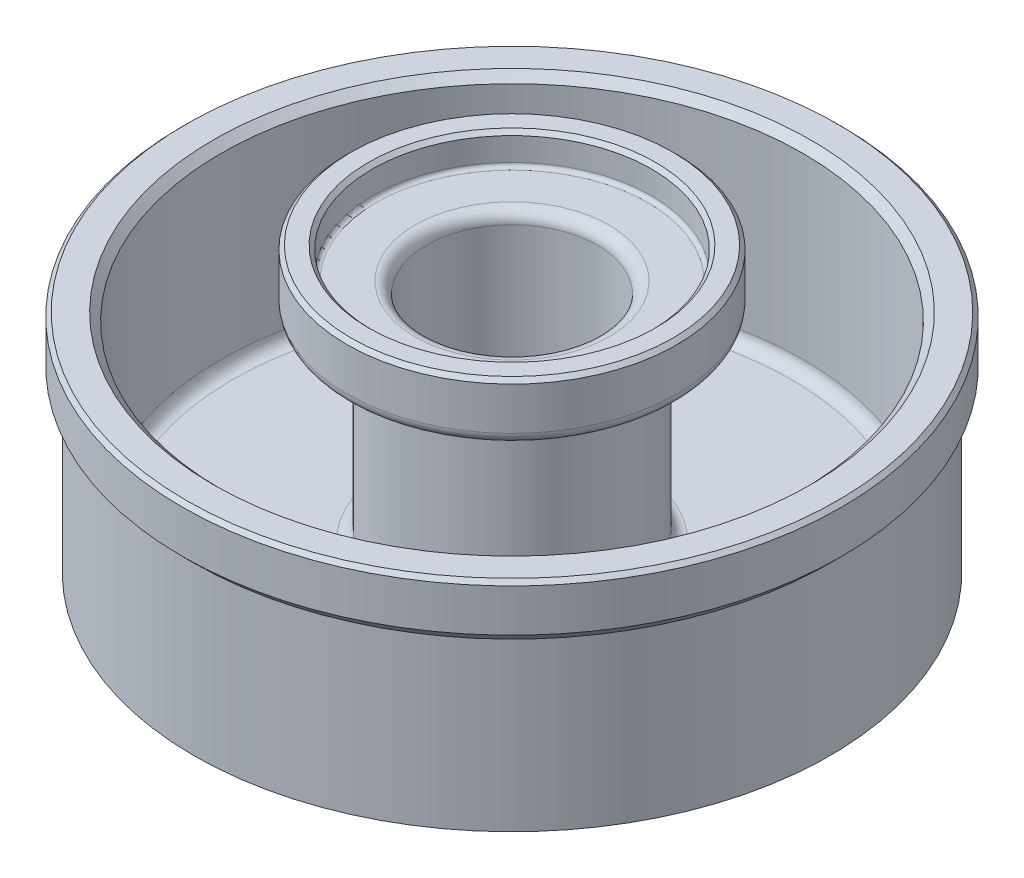
ISO-10303-21;
HEADER;
FILE_DESCRIPTION(('STEP AP214'),'2;1');
FILE_NAME('part.step','',(''),(''),'','','');
FILE_SCHEMA(('AUTOMOTIVE_DESIGN { 1 0 10303 214 1 1 1 1 }'));
ENDSEC;
DATA;
#1=APPLICATION_CONTEXT('core data for automotive mechanical design processes');
#2=APPLICATION_PROTOCOL_DEFINITION('international standard','automotive_design',2000,#1);
#3=PRODUCT_CONTEXT('',#1,'mechanical');
#4=PRODUCT('Part','Part','',(#3));
#5=PRODUCT_RELATED_PRODUCT_CATEGORY('part','',(#4));
#6=PRODUCT_DEFINITION_FORMATION('','',#4);
#7=PRODUCT_DEFINITION_CONTEXT('part definition',#1,'design');
#8=PRODUCT_DEFINITION('design','',#6,#7);
#9=PRODUCT_DEFINITION_SHAPE('','',#8);
#10=(LENGTH_UNIT() NAMED_UNIT(*) SI_UNIT(.MILLI.,.METRE.));
#11=(NAMED_UNIT(*) PLANE_ANGLE_UNIT() SI_UNIT($,.RADIAN.));
#12=(NAMED_UNIT(*) SI_UNIT($,.STERADIAN.) SOLID_ANGLE_UNIT());
#13=UNCERTAINTY_MEASURE_WITH_UNIT(LENGTH_MEASURE(1.E-05),#10,'distance_accuracy_value','');
#14=(GEOMETRIC_REPRESENTATION_CONTEXT(3) GLOBAL_UNCERTAINTY_ASSIGNED_CONTEXT((#13)) GLOBAL_UNIT_ASSIGNED_CONTEXT((#10,
#11,#12)) REPRESENTATION_CONTEXT('',''));
#15=CARTESIAN_POINT('',(0.,0.,0.));
#16=DIRECTION('',(0.,0.,1.));
#17=DIRECTION('',(1.,0.,0.));
#18=AXIS2_PLACEMENT_3D('',#15,#16,#17);
#19=CARTESIAN_POINT('',(0.,43.,0.));
#20=DIRECTION('',(0.,-1.,0.));
#21=DIRECTION('',(0.,0.,-1.));
#22=AXIS2_PLACEMENT_3D('',#19,#20,#21);
#23=CYLINDRICAL_SURFACE('',#22,82.);
#24=CARTESIAN_POINT('',(0.,43.,0.));
#25=DIRECTION('',(0.,1.,0.));
#26=DIRECTION('',(0.,0.,1.));
#27=AXIS2_PLACEMENT_3D('',#24,#25,#26);
#28=CIRCLE('',#27,82.);
#29=CARTESIAN_POINT('',(0.,43.,82.));
#30=VERTEX_POINT('',#29);
#31=EDGE_CURVE('E138',#30,#30,#28,.T.);
#32=ORIENTED_EDGE('',*,*,#31,.F.);
#33=EDGE_LOOP('',(#32));
#34=FACE_BOUND('',#33,.T.);
#35=CARTESIAN_POINT('',(0.,0.,0.));
#36=DIRECTION('',(0.,1.,0.));
#37=DIRECTION('',(0.,0.,1.));
#38=AXIS2_PLACEMENT_3D('',#35,#36,#37);
#39=CIRCLE('',#38,82.);
#40=CARTESIAN_POINT('',(0.,0.,82.));
#41=VERTEX_POINT('',#40);
#42=EDGE_CURVE('E139',#41,#41,#39,.T.);
#43=ORIENTED_EDGE('',*,*,#42,.T.);
#44=EDGE_LOOP('',(#43));
#45=FACE_BOUND('',#44,.T.);
#46=ADVANCED_FACE('F38',(#34,#45),#23,.T.);
#47=CARTESIAN_POINT('',(0.,0.,0.));
#48=DIRECTION('',(0.,1.,0.));
#49=DIRECTION('',(0.,0.,1.));
#50=AXIS2_PLACEMENT_3D('',#47,#48,#49);
#51=PLANE('',#50);
#52=CARTESIAN_POINT('',(0.,0.,0.));
#53=DIRECTION('',(0.,1.,0.));
#54=DIRECTION('',(0.,0.,1.));
#55=AXIS2_PLACEMENT_3D('',#52,#53,#54);
#56=CIRCLE('',#55,25.);
#57=CARTESIAN_POINT('',(0.,0.,25.));
#58=VERTEX_POINT('',#57);
#59=EDGE_CURVE('E78',#58,#58,#56,.T.);
#60=ORIENTED_EDGE('',*,*,#59,.T.);
#61=EDGE_LOOP('',(#60));
#62=FACE_BOUND('',#61,.T.);
#63=ORIENTED_EDGE('',*,*,#42,.F.);
#64=EDGE_LOOP('',(#63));
#65=FACE_BOUND('',#64,.T.);
#66=ADVANCED_FACE('F152',(#62,#65),#51,.F.);
#67=CARTESIAN_POINT('',(0.,58.,0.));
#68=DIRECTION('',(0.,-1.,0.));
#69=DIRECTION('',(0.,0.,-1.));
#70=AXIS2_PLACEMENT_3D('',#67,#68,#69);
#71=CYLINDRICAL_SURFACE('',#70,85.);
#72=CARTESIAN_POINT('',(0.,46.,0.));
#73=DIRECTION('',(0.,1.,0.));
#74=DIRECTION('',(0.,0.,1.));
#75=AXIS2_PLACEMENT_3D('',#72,#73,#74);
#76=CIRCLE('',#75,85.);
#77=CARTESIAN_POINT('',(0.,46.,85.));
#78=VERTEX_POINT('',#77);
#79=EDGE_CURVE('E51',#78,#78,#76,.T.);
#80=ORIENTED_EDGE('',*,*,#79,.T.);
#81=EDGE_LOOP('',(#80));
#82=FACE_BOUND('',#81,.T.);
#83=CARTESIAN_POINT('',(0.,57.,0.));
#84=DIRECTION('',(0.,1.,0.));
#85=DIRECTION('',(0.,0.,1.));
#86=AXIS2_PLACEMENT_3D('',#83,#84,#85);
#87=CIRCLE('',#86,85.);
#88=CARTESIAN_POINT('',(0.,57.,85.));
#89=VERTEX_POINT('',#88);
#90=EDGE_CURVE('E130',#89,#89,#87,.F.);
#91=ORIENTED_EDGE('',*,*,#90,.T.);
#92=EDGE_LOOP('',(#91));
#93=FACE_BOUND('',#92,.T.);
#94=ADVANCED_FACE('F157',(#82,#93),#71,.T.);
#95=CARTESIAN_POINT('',(0.,58.,0.));
#96=DIRECTION('',(0.,1.,0.));
#97=DIRECTION('',(0.,0.,1.));
#98=AXIS2_PLACEMENT_3D('',#95,#96,#97);
#99=PLANE('',#98);
#100=CARTESIAN_POINT('',(0.,58.,0.));
#101=DIRECTION('',(0.,1.,0.));
#102=DIRECTION('',(0.,0.,1.));
#103=AXIS2_PLACEMENT_3D('',#100,#101,#102);
#104=CIRCLE('',#103,77.);
#105=CARTESIAN_POINT('',(0.,58.,77.));
#106=VERTEX_POINT('',#105);
#107=EDGE_CURVE('E106',#106,#106,#104,.F.);
#108=ORIENTED_EDGE('',*,*,#107,.T.);
#109=EDGE_LOOP('',(#108));
#110=FACE_BOUND('',#109,.T.);
#111=CARTESIAN_POINT('',(0.,58.,0.));
#112=DIRECTION('',(0.,1.,0.));
#113=DIRECTION('',(0.,0.,1.));
#114=AXIS2_PLACEMENT_3D('',#111,#112,#113);
#115=CIRCLE('',#114,84.);
#116=CARTESIAN_POINT('',(0.,58.,84.));
#117=VERTEX_POINT('',#116);
#118=EDGE_CURVE('E134',#117,#117,#115,.T.);
#119=ORIENTED_EDGE('',*,*,#118,.T.);
#120=EDGE_LOOP('',(#119));
#121=FACE_BOUND('',#120,.T.);
#122=ADVANCED_FACE('F164',(#110,#121),#99,.T.);
#123=CARTESIAN_POINT('',(0.,7.,0.));
#124=DIRECTION('',(0.,1.,0.));
#125=DIRECTION('',(0.,0.,1.));
#126=AXIS2_PLACEMENT_3D('',#123,#124,#125);
#127=CYLINDRICAL_SURFACE('',#126,75.);
#128=CARTESIAN_POINT('',(0.,10.,0.));
#129=DIRECTION('',(0.,1.,0.));
#130=DIRECTION('',(0.,0.,1.));
#131=AXIS2_PLACEMENT_3D('',#128,#129,#130);
#132=CIRCLE('',#131,75.);
#133=CARTESIAN_POINT('',(0.,10.,75.));
#134=VERTEX_POINT('',#133);
#135=EDGE_CURVE('E62',#134,#134,#132,.F.);
#136=ORIENTED_EDGE('',*,*,#135,.T.);
#137=EDGE_LOOP('',(#136));
#138=FACE_BOUND('',#137,.T.);
#139=CARTESIAN_POINT('',(0.,56.,0.));
#140=DIRECTION('',(0.,1.,0.));
#141=DIRECTION('',(0.,0.,1.));
#142=AXIS2_PLACEMENT_3D('',#139,#140,#141);
#143=CIRCLE('',#142,75.);
#144=CARTESIAN_POINT('',(0.,56.,75.));
#145=VERTEX_POINT('',#144);
#146=EDGE_CURVE('E110',#145,#145,#143,.T.);
#147=ORIENTED_EDGE('',*,*,#146,.T.);
#148=EDGE_LOOP('',(#147));
#149=FACE_BOUND('',#148,.T.);
#150=ADVANCED_FACE('F344',(#138,#149),#127,.F.);
#151=CARTESIAN_POINT('',(0.,7.,0.));
#152=DIRECTION('',(0.,1.,0.));
#153=DIRECTION('',(0.,0.,1.));
#154=AXIS2_PLACEMENT_3D('',#151,#152,#153);
#155=PLANE('',#154);
#156=CARTESIAN_POINT('',(0.,7.,0.));
#157=DIRECTION('',(0.,1.,0.));
#158=DIRECTION('',(0.,0.,1.));
#159=AXIS2_PLACEMENT_3D('',#156,#157,#158);
#160=CIRCLE('',#159,32.);
#161=CARTESIAN_POINT('',(0.,7.,32.));
#162=VERTEX_POINT('',#161);
#163=EDGE_CURVE('E90',#162,#162,#160,.F.);
#164=ORIENTED_EDGE('',*,*,#163,.T.);
#165=EDGE_LOOP('',(#164));
#166=FACE_BOUND('',#165,.T.);
#167=CARTESIAN_POINT('',(0.,7.,0.));
#168=DIRECTION('',(0.,1.,0.));
#169=DIRECTION('',(0.,0.,1.));
#170=AXIS2_PLACEMENT_3D('',#167,#168,#169);
#171=CIRCLE('',#170,72.);
#172=CARTESIAN_POINT('',(0.,7.,72.));
#173=VERTEX_POINT('',#172);
#174=EDGE_CURVE('E94',#173,#173,#171,.T.);
#175=ORIENTED_EDGE('',*,*,#174,.T.);
#176=EDGE_LOOP('',(#175));
#177=FACE_BOUND('',#176,.T.);
#178=ADVANCED_FACE('F334',(#166,#177),#155,.T.);
#179=CARTESIAN_POINT('',(0.,58.,0.));
#180=DIRECTION('',(0.,-1.,0.));
#181=DIRECTION('',(0.,0.,-1.));
#182=AXIS2_PLACEMENT_3D('',#179,#180,#181);
#183=CYLINDRICAL_SURFACE('',#182,29.);
#184=CARTESIAN_POINT('',(0.,9.99999999999999,0.));
#185=DIRECTION('',(0.,1.,0.));
#186=DIRECTION('',(0.,0.,1.));
#187=AXIS2_PLACEMENT_3D('',#184,#185,#186);
#188=CIRCLE('',#187,29.);
#189=CARTESIAN_POINT('',(0.,9.99999999999999,29.));
#190=VERTEX_POINT('',#189);
#191=EDGE_CURVE('E98',#190,#190,#188,.T.);
#192=ORIENTED_EDGE('',*,*,#191,.T.);
#193=EDGE_LOOP('',(#192));
#194=FACE_BOUND('',#193,.T.);
#195=CARTESIAN_POINT('',(0.,55.,0.));
#196=DIRECTION('',(0.,1.,0.));
#197=DIRECTION('',(0.,0.,1.));
#198=AXIS2_PLACEMENT_3D('',#195,#196,#197);
#199=CIRCLE('',#198,29.);
#200=CARTESIAN_POINT('',(0.,55.,29.));
#201=VERTEX_POINT('',#200);
#202=EDGE_CURVE('E102',#201,#201,#199,.F.);
#203=ORIENTED_EDGE('',*,*,#202,.T.);
#204=EDGE_LOOP('',(#203));
#205=FACE_BOUND('',#204,.T.);
#206=ADVANCED_FACE('F324',(#194,#205),#183,.T.);
#207=CARTESIAN_POINT('',(0.,73.,0.));
#208=DIRECTION('',(0.,-1.,0.));
#209=DIRECTION('',(0.,0.,-1.));
#210=AXIS2_PLACEMENT_3D('',#207,#208,#209);
#211=CYLINDRICAL_SURFACE('',#210,42.5);
#212=CARTESIAN_POINT('',(0.,61.,0.));
#213=DIRECTION('',(0.,1.,0.));
#214=DIRECTION('',(0.,0.,1.));
#215=AXIS2_PLACEMENT_3D('',#212,#213,#214);
#216=CIRCLE('',#215,42.5);
#217=CARTESIAN_POINT('',(0.,61.,42.5));
#218=VERTEX_POINT('',#217);
#219=EDGE_CURVE('E56',#218,#218,#216,.T.);
#220=ORIENTED_EDGE('',*,*,#219,.T.);
#221=EDGE_LOOP('',(#220));
#222=FACE_BOUND('',#221,.T.);
#223=CARTESIAN_POINT('',(0.,72.,0.));
#224=DIRECTION('',(0.,1.,0.));
#225=DIRECTION('',(0.,0.,1.));
#226=AXIS2_PLACEMENT_3D('',#223,#224,#225);
#227=CIRCLE('',#226,42.5);
#228=CARTESIAN_POINT('',(0.,72.,42.5));
#229=VERTEX_POINT('',#228);
#230=EDGE_CURVE('E118',#229,#229,#227,.F.);
#231=ORIENTED_EDGE('',*,*,#230,.T.);
#232=EDGE_LOOP('',(#231));
#233=FACE_BOUND('',#232,.T.);
#234=ADVANCED_FACE('F319',(#222,#233),#211,.T.);
#235=CARTESIAN_POINT('',(0.,73.,0.));
#236=DIRECTION('',(0.,1.,0.));
#237=DIRECTION('',(0.,0.,1.));
#238=AXIS2_PLACEMENT_3D('',#235,#236,#237);
#239=PLANE('',#238);
#240=CARTESIAN_POINT('',(0.,73.,0.));
#241=DIRECTION('',(0.,1.,0.));
#242=DIRECTION('',(0.,0.,1.));
#243=AXIS2_PLACEMENT_3D('',#240,#241,#242);
#244=CIRCLE('',#243,41.5);
#245=CARTESIAN_POINT('',(0.,73.,41.5));
#246=VERTEX_POINT('',#245);
#247=EDGE_CURVE('E122',#246,#246,#244,.T.);
#248=ORIENTED_EDGE('',*,*,#247,.T.);
#249=EDGE_LOOP('',(#248));
#250=FACE_BOUND('',#249,.T.);
#251=CARTESIAN_POINT('',(0.,73.,0.));
#252=DIRECTION('',(0.,1.,0.));
#253=DIRECTION('',(0.,0.,1.));
#254=AXIS2_PLACEMENT_3D('',#251,#252,#253);
#255=CIRCLE('',#254,37.);
#256=CARTESIAN_POINT('',(0.,73.,37.));
#257=VERTEX_POINT('',#256);
#258=EDGE_CURVE('E126',#257,#257,#255,.F.);
#259=ORIENTED_EDGE('',*,*,#258,.T.);
#260=EDGE_LOOP('',(#259));
#261=FACE_BOUND('',#260,.T.);
#262=ADVANCED_FACE('F311',(#250,#261),#239,.T.);
#263=CARTESIAN_POINT('',(0.,58.,0.));
#264=DIRECTION('',(0.,1.,0.));
#265=DIRECTION('',(0.,0.,1.));
#266=AXIS2_PLACEMENT_3D('',#263,#264,#265);
#267=PLANE('',#266);
#268=CARTESIAN_POINT('',(0.,58.,0.));
#269=DIRECTION('',(0.,1.,0.));
#270=DIRECTION('',(0.,0.,1.));
#271=AXIS2_PLACEMENT_3D('',#268,#269,#270);
#272=CIRCLE('',#271,32.);
#273=CARTESIAN_POINT('',(0.,58.,32.));
#274=VERTEX_POINT('',#273);
#275=EDGE_CURVE('E82',#274,#274,#272,.T.);
#276=ORIENTED_EDGE('',*,*,#275,.T.);
#277=EDGE_LOOP('',(#276));
#278=FACE_BOUND('',#277,.T.);
#279=CARTESIAN_POINT('',(0.,58.,0.));
#280=DIRECTION('',(0.,1.,0.));
#281=DIRECTION('',(0.,0.,1.));
#282=AXIS2_PLACEMENT_3D('',#279,#280,#281);
#283=CIRCLE('',#282,39.5);
#284=CARTESIAN_POINT('',(0.,58.,39.5));
#285=VERTEX_POINT('',#284);
#286=EDGE_CURVE('E86',#285,#285,#283,.F.);
#287=ORIENTED_EDGE('',*,*,#286,.T.);
#288=EDGE_LOOP('',(#287));
#289=FACE_BOUND('',#288,.T.);
#290=ADVANCED_FACE('F249',(#278,#289),#267,.F.);
#291=CARTESIAN_POINT('',(0.,65.,0.));
#292=DIRECTION('',(0.,1.,0.));
#293=DIRECTION('',(0.,0.,1.));
#294=AXIS2_PLACEMENT_3D('',#291,#292,#293);
#295=CYLINDRICAL_SURFACE('',#294,36.);
#296=CARTESIAN_POINT('',(0.,66.,0.));
#297=DIRECTION('',(0.,1.,0.));
#298=DIRECTION('',(0.,0.,1.));
#299=AXIS2_PLACEMENT_3D('',#296,#297,#298);
#300=CIRCLE('',#299,36.);
#301=CARTESIAN_POINT('',(0.,66.,36.));
#302=VERTEX_POINT('',#301);
#303=EDGE_CURVE('E10',#302,#302,#300,.F.);
#304=ORIENTED_EDGE('',*,*,#303,.T.);
#305=EDGE_LOOP('',(#304));
#306=FACE_BOUND('',#305,.T.);
#307=CARTESIAN_POINT('',(0.,72.,0.));
#308=DIRECTION('',(0.,1.,0.));
#309=DIRECTION('',(0.,0.,1.));
#310=AXIS2_PLACEMENT_3D('',#307,#308,#309);
#311=CIRCLE('',#310,36.);
#312=CARTESIAN_POINT('',(0.,72.,36.));
#313=VERTEX_POINT('',#312);
#314=EDGE_CURVE('E114',#313,#313,#311,.T.);
#315=ORIENTED_EDGE('',*,*,#314,.T.);
#316=EDGE_LOOP('',(#315));
#317=FACE_BOUND('',#316,.T.);
#318=ADVANCED_FACE('F242',(#306,#317),#295,.F.);
#319=CARTESIAN_POINT('',(0.,65.,0.));
#320=DIRECTION('',(0.,1.,0.));
#321=DIRECTION('',(0.,0.,1.));
#322=AXIS2_PLACEMENT_3D('',#319,#320,#321);
#323=PLANE('',#322);
#324=CARTESIAN_POINT('',(0.,65.,0.));
#325=DIRECTION('',(0.,1.,0.));
#326=DIRECTION('',(0.,0.,1.));
#327=AXIS2_PLACEMENT_3D('',#324,#325,#326);
#328=CIRCLE('',#327,35.);
#329=CARTESIAN_POINT('',(0.,65.,35.));
#330=VERTEX_POINT('',#329);
#331=EDGE_CURVE('E46',#330,#330,#328,.T.);
#332=ORIENTED_EDGE('',*,*,#331,.T.);
#333=EDGE_LOOP('',(#332));
#334=FACE_BOUND('',#333,.T.);
#335=CARTESIAN_POINT('',(0.,65.,0.));
#336=DIRECTION('',(0.,1.,0.));
#337=DIRECTION('',(0.,0.,1.));
#338=AXIS2_PLACEMENT_3D('',#335,#336,#337);
#339=CIRCLE('',#338,25.);
#340=CARTESIAN_POINT('',(0.,65.,25.));
#341=VERTEX_POINT('',#340);
#342=EDGE_CURVE('E66',#341,#341,#339,.F.);
#343=ORIENTED_EDGE('',*,*,#342,.T.);
#344=EDGE_LOOP('',(#343));
#345=FACE_BOUND('',#344,.T.);
#346=ADVANCED_FACE('F238',(#334,#345),#323,.T.);
#347=CARTESIAN_POINT('',(0.,0.,0.));
#348=DIRECTION('',(0.,1.,0.));
#349=DIRECTION('',(0.,0.,1.));
#350=AXIS2_PLACEMENT_3D('',#347,#348,#349);
#351=CYLINDRICAL_SURFACE('',#350,22.);
#352=CARTESIAN_POINT('',(0.,3.,0.));
#353=DIRECTION('',(0.,1.,0.));
#354=DIRECTION('',(0.,0.,1.));
#355=AXIS2_PLACEMENT_3D('',#352,#353,#354);
#356=CIRCLE('',#355,22.);
#357=CARTESIAN_POINT('',(0.,3.,22.));
#358=VERTEX_POINT('',#357);
#359=EDGE_CURVE('E70',#358,#358,#356,.F.);
#360=ORIENTED_EDGE('',*,*,#359,.T.);
#361=EDGE_LOOP('',(#360));
#362=FACE_BOUND('',#361,.T.);
#363=CARTESIAN_POINT('',(0.,62.,0.));
#364=DIRECTION('',(0.,1.,0.));
#365=DIRECTION('',(0.,0.,1.));
#366=AXIS2_PLACEMENT_3D('',#363,#364,#365);
#367=CIRCLE('',#366,22.);
#368=CARTESIAN_POINT('',(0.,62.,22.));
#369=VERTEX_POINT('',#368);
#370=EDGE_CURVE('E74',#369,#369,#367,.T.);
#371=ORIENTED_EDGE('',*,*,#370,.T.);
#372=EDGE_LOOP('',(#371));
#373=FACE_BOUND('',#372,.T.);
#374=ADVANCED_FACE('F177',(#362,#373),#351,.F.);
#375=CARTESIAN_POINT('',(0.,58.,0.));
#376=DIRECTION('',(0.,-1.,0.));
#377=DIRECTION('',(0.,0.,-1.));
#378=AXIS2_PLACEMENT_3D('',#375,#376,#377);
#379=CONICAL_SURFACE('',#378,84.,0.785398163397462);
#380=ORIENTED_EDGE('',*,*,#90,.F.);
#381=EDGE_LOOP('',(#380));
#382=FACE_BOUND('',#381,.T.);
#383=ORIENTED_EDGE('',*,*,#118,.F.);
#384=EDGE_LOOP('',(#383));
#385=FACE_BOUND('',#384,.T.);
#386=ADVANCED_FACE('F170',(#382,#385),#379,.T.);
#387=CARTESIAN_POINT('',(0.,73.,0.));
#388=DIRECTION('',(0.,-1.,0.));
#389=DIRECTION('',(0.,0.,-1.));
#390=AXIS2_PLACEMENT_3D('',#387,#388,#389);
#391=CONICAL_SURFACE('',#390,41.5,0.785398163397455);
#392=ORIENTED_EDGE('',*,*,#230,.F.);
#393=EDGE_LOOP('',(#392));
#394=FACE_BOUND('',#393,.T.);
#395=ORIENTED_EDGE('',*,*,#247,.F.);
#396=EDGE_LOOP('',(#395));
#397=FACE_BOUND('',#396,.T.);
#398=ADVANCED_FACE('F176',(#394,#397),#391,.T.);
#399=CARTESIAN_POINT('',(0.,72.,0.));
#400=DIRECTION('',(0.,1.,0.));
#401=DIRECTION('',(0.,0.,1.));
#402=AXIS2_PLACEMENT_3D('',#399,#400,#401);
#403=CONICAL_SURFACE('',#402,36.,0.785398163397452);
#404=ORIENTED_EDGE('',*,*,#258,.F.);
#405=EDGE_LOOP('',(#404));
#406=FACE_BOUND('',#405,.T.);
#407=ORIENTED_EDGE('',*,*,#314,.F.);
#408=EDGE_LOOP('',(#407));
#409=FACE_BOUND('',#408,.T.);
#410=ADVANCED_FACE('F184',(#406,#409),#403,.F.);
#411=CARTESIAN_POINT('',(0.,56.,0.));
#412=DIRECTION('',(0.,1.,0.));
#413=DIRECTION('',(0.,0.,1.));
#414=AXIS2_PLACEMENT_3D('',#411,#412,#413);
#415=CONICAL_SURFACE('',#414,75.,0.785398163397445);
#416=ORIENTED_EDGE('',*,*,#107,.F.);
#417=EDGE_LOOP('',(#416));
#418=FACE_BOUND('',#417,.T.);
#419=ORIENTED_EDGE('',*,*,#146,.F.);
#420=EDGE_LOOP('',(#419));
#421=FACE_BOUND('',#420,.T.);
#422=ADVANCED_FACE('F191',(#418,#421),#415,.F.);
#423=CARTESIAN_POINT('',(0.,9.99999999999999,0.));
#424=DIRECTION('',(0.,1.,0.));
#425=DIRECTION('',(0.,0.,1.));
#426=AXIS2_PLACEMENT_3D('',#423,#424,#425);
#427=TOROIDAL_SURFACE('',#426,32.,3.);
#428=ORIENTED_EDGE('',*,*,#163,.F.);
#429=EDGE_LOOP('',(#428));
#430=FACE_BOUND('',#429,.T.);
#431=ORIENTED_EDGE('',*,*,#191,.F.);
#432=EDGE_LOOP('',(#431));
#433=FACE_BOUND('',#432,.T.);
#434=ADVANCED_FACE('F198',(#430,#433),#427,.F.);
#435=CARTESIAN_POINT('',(0.,55.,0.));
#436=DIRECTION('',(0.,1.,0.));
#437=DIRECTION('',(0.,0.,1.));
#438=AXIS2_PLACEMENT_3D('',#435,#436,#437);
#439=TOROIDAL_SURFACE('',#438,32.,3.);
#440=ORIENTED_EDGE('',*,*,#202,.F.);
#441=EDGE_LOOP('',(#440));
#442=FACE_BOUND('',#441,.T.);
#443=ORIENTED_EDGE('',*,*,#275,.F.);
#444=EDGE_LOOP('',(#443));
#445=FACE_BOUND('',#444,.T.);
#446=ADVANCED_FACE('F202',(#442,#445),#439,.F.);
#447=CARTESIAN_POINT('',(0.,3.,0.));
#448=DIRECTION('',(0.,1.,0.));
#449=DIRECTION('',(0.,0.,1.));
#450=AXIS2_PLACEMENT_3D('',#447,#448,#449);
#451=TOROIDAL_SURFACE('',#450,25.,3.);
#452=ORIENTED_EDGE('',*,*,#359,.F.);
#453=EDGE_LOOP('',(#452));
#454=FACE_BOUND('',#453,.T.);
#455=ORIENTED_EDGE('',*,*,#59,.F.);
#456=EDGE_LOOP('',(#455));
#457=FACE_BOUND('',#456,.T.);
#458=ADVANCED_FACE('F206',(#454,#457),#451,.T.);
#459=CARTESIAN_POINT('',(0.,62.,0.));
#460=DIRECTION('',(0.,1.,0.));
#461=DIRECTION('',(0.,0.,1.));
#462=AXIS2_PLACEMENT_3D('',#459,#460,#461);
#463=TOROIDAL_SURFACE('',#462,25.,3.);
#464=ORIENTED_EDGE('',*,*,#342,.F.);
#465=EDGE_LOOP('',(#464));
#466=FACE_BOUND('',#465,.T.);
#467=ORIENTED_EDGE('',*,*,#370,.F.);
#468=EDGE_LOOP('',(#467));
#469=FACE_BOUND('',#468,.T.);
#470=ADVANCED_FACE('F210',(#466,#469),#463,.T.);
#471=CARTESIAN_POINT('',(0.,10.,0.));
#472=DIRECTION('',(0.,1.,0.));
#473=DIRECTION('',(0.,0.,1.));
#474=AXIS2_PLACEMENT_3D('',#471,#472,#473);
#475=TOROIDAL_SURFACE('',#474,72.,3.);
#476=ORIENTED_EDGE('',*,*,#135,.F.);
#477=EDGE_LOOP('',(#476));
#478=FACE_BOUND('',#477,.T.);
#479=ORIENTED_EDGE('',*,*,#174,.F.);
#480=EDGE_LOOP('',(#479));
#481=FACE_BOUND('',#480,.T.);
#482=ADVANCED_FACE('F214',(#478,#481),#475,.F.);
#483=CARTESIAN_POINT('',(0.,61.,0.));
#484=DIRECTION('',(0.,1.,0.));
#485=DIRECTION('',(0.,0.,1.));
#486=AXIS2_PLACEMENT_3D('',#483,#484,#485);
#487=TOROIDAL_SURFACE('',#486,39.5,3.);
#488=ORIENTED_EDGE('',*,*,#286,.F.);
#489=EDGE_LOOP('',(#488));
#490=FACE_BOUND('',#489,.T.);
#491=ORIENTED_EDGE('',*,*,#219,.F.);
#492=EDGE_LOOP('',(#491));
#493=FACE_BOUND('',#492,.T.);
#494=ADVANCED_FACE('F218',(#490,#493),#487,.T.);
#495=CARTESIAN_POINT('',(0.,46.,0.));
#496=DIRECTION('',(0.,1.,0.));
#497=DIRECTION('',(0.,0.,1.));
#498=AXIS2_PLACEMENT_3D('',#495,#496,#497);
#499=CONICAL_SURFACE('',#498,85.,0.785398163397451);
#500=ORIENTED_EDGE('',*,*,#31,.T.);
#501=EDGE_LOOP('',(#500));
#502=FACE_BOUND('',#501,.T.);
#503=ORIENTED_EDGE('',*,*,#79,.F.);
#504=EDGE_LOOP('',(#503));
#505=FACE_BOUND('',#504,.T.);
#506=ADVANCED_FACE('F147',(#502,#505),#499,.T.);
#507=CARTESIAN_POINT('',(0.,66.,0.));
#508=DIRECTION('',(0.,1.,0.));
#509=DIRECTION('',(0.,0.,1.));
#510=AXIS2_PLACEMENT_3D('',#507,#508,#509);
#511=TOROIDAL_SURFACE('',#510,35.,1.);
#512=ORIENTED_EDGE('',*,*,#303,.F.);
#513=EDGE_LOOP('',(#512));
#514=FACE_BOUND('',#513,.T.);
#515=ORIENTED_EDGE('',*,*,#331,.F.);
#516=EDGE_LOOP('',(#515));
#517=FACE_BOUND('',#516,.T.);
#518=ADVANCED_FACE('F40',(#514,#517),#511,.F.);
#519=CLOSED_SHELL('',(#46,#66,#94,#122,#150,#178,#206,#234,#262,#290,#318,#346,#374,#386,#398,
#410,#422,#434,#446,#458,#470,#482,#494,#506,#518));
#520=MANIFOLD_SOLID_BREP('B2',#519);
#521=ADVANCED_BREP_SHAPE_REPRESENTATION('',(#18,#520),#14);
#522=SHAPE_DEFINITION_REPRESENTATION(#9,#521);
ENDSEC;
END-ISO-10303-21;
